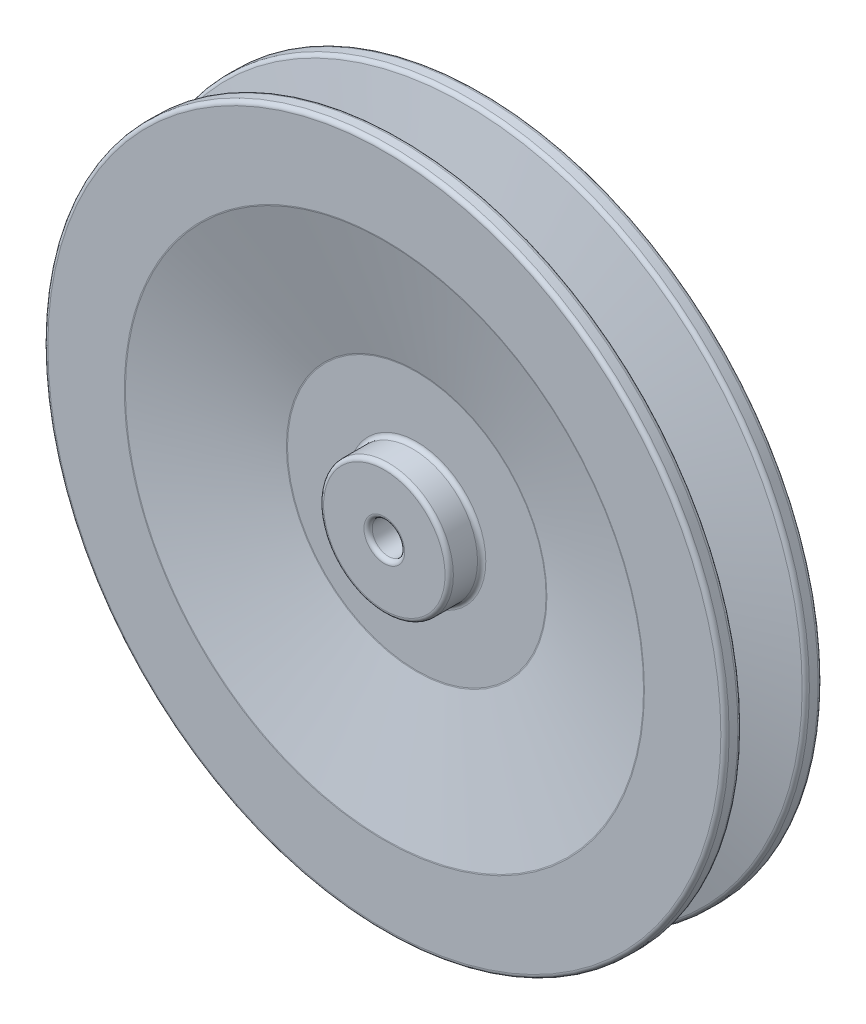
ISO-10303-21;
HEADER;
FILE_DESCRIPTION(('STEP AP214'),'2;1');
FILE_NAME('part.step','',(''),(''),'','','');
FILE_SCHEMA(('AUTOMOTIVE_DESIGN { 1 0 10303 214 1 1 1 1 }'));
ENDSEC;
DATA;
#1=APPLICATION_CONTEXT('core data for automotive mechanical design processes');
#2=APPLICATION_PROTOCOL_DEFINITION('international standard','automotive_design',2000,#1);
#3=PRODUCT_CONTEXT('',#1,'mechanical');
#4=PRODUCT('Part','Part','',(#3));
#5=PRODUCT_RELATED_PRODUCT_CATEGORY('part','',(#4));
#6=PRODUCT_DEFINITION_FORMATION('','',#4);
#7=PRODUCT_DEFINITION_CONTEXT('part definition',#1,'design');
#8=PRODUCT_DEFINITION('design','',#6,#7);
#9=PRODUCT_DEFINITION_SHAPE('','',#8);
#10=(LENGTH_UNIT() NAMED_UNIT(*) SI_UNIT(.MILLI.,.METRE.));
#11=(NAMED_UNIT(*) PLANE_ANGLE_UNIT() SI_UNIT($,.RADIAN.));
#12=(NAMED_UNIT(*) SI_UNIT($,.STERADIAN.) SOLID_ANGLE_UNIT());
#13=UNCERTAINTY_MEASURE_WITH_UNIT(LENGTH_MEASURE(1.E-05),#10,'distance_accuracy_value','');
#14=(GEOMETRIC_REPRESENTATION_CONTEXT(3) GLOBAL_UNCERTAINTY_ASSIGNED_CONTEXT((#13)) GLOBAL_UNIT_ASSIGNED_CONTEXT((#10,
#11,#12)) REPRESENTATION_CONTEXT('',''));
#15=CARTESIAN_POINT('',(0.,0.,0.));
#16=DIRECTION('',(0.,0.,1.));
#17=DIRECTION('',(1.,0.,0.));
#18=AXIS2_PLACEMENT_3D('',#15,#16,#17);
#19=CARTESIAN_POINT('',(0.,0.,-12.7));
#20=DIRECTION('',(0.,0.,-1.));
#21=DIRECTION('',(-1.,0.,0.));
#22=AXIS2_PLACEMENT_3D('',#19,#20,#21);
#23=CONICAL_SURFACE('',#22,25.4,1.32581766366803);
#24=CARTESIAN_POINT('',(0.,0.,-12.7242681758819));
#25=DIRECTION('',(0.,0.,-1.));
#26=DIRECTION('',(-1.,0.,0.));
#27=AXIS2_PLACEMENT_3D('',#24,#25,#26);
#28=CIRCLE('',#27,25.4970727035275);
#29=CARTESIAN_POINT('',(-25.4970727035275,0.,-12.7242681758819));
#30=VERTEX_POINT('',#29);
#31=EDGE_CURVE('E165',#30,#30,#28,.F.);
#32=ORIENTED_EDGE('',*,*,#31,.T.);
#33=EDGE_LOOP('',(#32));
#34=FACE_BOUND('',#33,.T.);
#35=CARTESIAN_POINT('',(0.,0.,-19.0257318241181));
#36=DIRECTION('',(0.,0.,1.));
#37=DIRECTION('',(1.,0.,0.));
#38=AXIS2_PLACEMENT_3D('',#35,#36,#37);
#39=CIRCLE('',#38,50.7029272964725);
#40=CARTESIAN_POINT('',(50.7029272964725,0.,-19.0257318241181));
#41=VERTEX_POINT('',#40);
#42=EDGE_CURVE('E169',#41,#41,#39,.F.);
#43=ORIENTED_EDGE('',*,*,#42,.T.);
#44=EDGE_LOOP('',(#43));
#45=FACE_BOUND('',#44,.T.);
#46=ADVANCED_FACE('F37',(#34,#45),#23,.F.);
#47=CARTESIAN_POINT('',(0.,0.,-12.7));
#48=DIRECTION('',(0.,0.,1.));
#49=DIRECTION('',(1.,0.,0.));
#50=AXIS2_PLACEMENT_3D('',#47,#48,#49);
#51=PLANE('',#50);
#52=CARTESIAN_POINT('',(0.,0.,-12.7));
#53=DIRECTION('',(0.,0.,1.));
#54=DIRECTION('',(1.,0.,0.));
#55=AXIS2_PLACEMENT_3D('',#52,#53,#54);
#56=CIRCLE('',#55,25.299939747498);
#57=CARTESIAN_POINT('',(25.299939747498,0.,-12.7));
#58=VERTEX_POINT('',#57);
#59=EDGE_CURVE('E157',#58,#58,#56,.F.);
#60=ORIENTED_EDGE('',*,*,#59,.T.);
#61=EDGE_LOOP('',(#60));
#62=FACE_BOUND('',#61,.T.);
#63=CARTESIAN_POINT('',(0.,0.,-12.7));
#64=DIRECTION('',(0.,0.,1.));
#65=DIRECTION('',(1.,0.,0.));
#66=AXIS2_PLACEMENT_3D('',#63,#64,#65);
#67=CIRCLE('',#66,13.5128);
#68=CARTESIAN_POINT('',(13.5128,0.,-12.7));
#69=VERTEX_POINT('',#68);
#70=EDGE_CURVE('E161',#69,#69,#67,.T.);
#71=ORIENTED_EDGE('',*,*,#70,.T.);
#72=EDGE_LOOP('',(#71));
#73=FACE_BOUND('',#72,.T.);
#74=ADVANCED_FACE('F184',(#62,#73),#51,.F.);
#75=CARTESIAN_POINT('',(0.,0.,0.));
#76=DIRECTION('',(0.,0.,1.));
#77=DIRECTION('',(1.,0.,0.));
#78=AXIS2_PLACEMENT_3D('',#75,#76,#77);
#79=CYLINDRICAL_SURFACE('',#78,12.7);
#80=CARTESIAN_POINT('',(0.,0.,-13.5128));
#81=DIRECTION('',(0.,0.,1.));
#82=DIRECTION('',(1.,0.,0.));
#83=AXIS2_PLACEMENT_3D('',#80,#81,#82);
#84=CIRCLE('',#83,12.7);
#85=CARTESIAN_POINT('',(12.7,0.,-13.5128));
#86=VERTEX_POINT('',#85);
#87=EDGE_CURVE('E149',#86,#86,#84,.F.);
#88=ORIENTED_EDGE('',*,*,#87,.T.);
#89=EDGE_LOOP('',(#88));
#90=FACE_BOUND('',#89,.T.);
#91=CARTESIAN_POINT('',(0.,0.,-18.2372));
#92=DIRECTION('',(0.,0.,1.));
#93=DIRECTION('',(1.,0.,0.));
#94=AXIS2_PLACEMENT_3D('',#91,#92,#93);
#95=CIRCLE('',#94,12.7);
#96=CARTESIAN_POINT('',(12.7,0.,-18.2372));
#97=VERTEX_POINT('',#96);
#98=EDGE_CURVE('E153',#97,#97,#95,.T.);
#99=ORIENTED_EDGE('',*,*,#98,.T.);
#100=EDGE_LOOP('',(#99));
#101=FACE_BOUND('',#100,.T.);
#102=ADVANCED_FACE('F190',(#90,#101),#79,.T.);
#103=CARTESIAN_POINT('',(0.,0.,-19.05));
#104=DIRECTION('',(0.,0.,1.));
#105=DIRECTION('',(1.,0.,0.));
#106=AXIS2_PLACEMENT_3D('',#103,#104,#105);
#107=PLANE('',#106);
#108=CARTESIAN_POINT('',(0.,0.,-19.05));
#109=DIRECTION('',(0.,0.,1.));
#110=DIRECTION('',(1.,0.,0.));
#111=AXIS2_PLACEMENT_3D('',#108,#109,#110);
#112=CIRCLE('',#111,11.8872);
#113=CARTESIAN_POINT('',(11.8872,0.,-19.05));
#114=VERTEX_POINT('',#113);
#115=EDGE_CURVE('E141',#114,#114,#112,.F.);
#116=ORIENTED_EDGE('',*,*,#115,.T.);
#117=EDGE_LOOP('',(#116));
#118=FACE_BOUND('',#117,.T.);
#119=CARTESIAN_POINT('',(0.,0.,-19.05));
#120=DIRECTION('',(0.,0.,1.));
#121=DIRECTION('',(1.,0.,0.));
#122=AXIS2_PLACEMENT_3D('',#119,#120,#121);
#123=CIRCLE('',#122,3.9878);
#124=CARTESIAN_POINT('',(3.9878,0.,-19.05));
#125=VERTEX_POINT('',#124);
#126=EDGE_CURVE('E145',#125,#125,#123,.T.);
#127=ORIENTED_EDGE('',*,*,#126,.T.);
#128=EDGE_LOOP('',(#127));
#129=FACE_BOUND('',#128,.T.);
#130=ADVANCED_FACE('F303',(#118,#129),#107,.F.);
#131=CARTESIAN_POINT('',(0.,0.,0.));
#132=DIRECTION('',(0.,0.,1.));
#133=DIRECTION('',(1.,0.,0.));
#134=AXIS2_PLACEMENT_3D('',#131,#132,#133);
#135=CYLINDRICAL_SURFACE('',#134,3.175);
#136=CARTESIAN_POINT('',(0.,0.,-18.2372));
#137=DIRECTION('',(0.,0.,1.));
#138=DIRECTION('',(1.,0.,0.));
#139=AXIS2_PLACEMENT_3D('',#136,#137,#138);
#140=CIRCLE('',#139,3.175);
#141=CARTESIAN_POINT('',(3.175,0.,-18.2372));
#142=VERTEX_POINT('',#141);
#143=EDGE_CURVE('E133',#142,#142,#140,.F.);
#144=ORIENTED_EDGE('',*,*,#143,.T.);
#145=EDGE_LOOP('',(#144));
#146=FACE_BOUND('',#145,.T.);
#147=CARTESIAN_POINT('',(0.,0.,-0.8128));
#148=DIRECTION('',(0.,0.,1.));
#149=DIRECTION('',(1.,0.,0.));
#150=AXIS2_PLACEMENT_3D('',#147,#148,#149);
#151=CIRCLE('',#150,3.175);
#152=CARTESIAN_POINT('',(3.175,0.,-0.8128));
#153=VERTEX_POINT('',#152);
#154=EDGE_CURVE('E137',#153,#153,#151,.T.);
#155=ORIENTED_EDGE('',*,*,#154,.T.);
#156=EDGE_LOOP('',(#155));
#157=FACE_BOUND('',#156,.T.);
#158=ADVANCED_FACE('F299',(#146,#157),#135,.F.);
#159=CARTESIAN_POINT('',(0.,0.,0.));
#160=DIRECTION('',(0.,0.,1.));
#161=DIRECTION('',(1.,0.,0.));
#162=AXIS2_PLACEMENT_3D('',#159,#160,#161);
#163=PLANE('',#162);
#164=CARTESIAN_POINT('',(0.,0.,0.));
#165=DIRECTION('',(0.,0.,1.));
#166=DIRECTION('',(1.,0.,0.));
#167=AXIS2_PLACEMENT_3D('',#164,#165,#166);
#168=CIRCLE('',#167,3.9878);
#169=CARTESIAN_POINT('',(3.9878,0.,0.));
#170=VERTEX_POINT('',#169);
#171=EDGE_CURVE('E125',#170,#170,#168,.F.);
#172=ORIENTED_EDGE('',*,*,#171,.T.);
#173=EDGE_LOOP('',(#172));
#174=FACE_BOUND('',#173,.T.);
#175=CARTESIAN_POINT('',(0.,0.,0.));
#176=DIRECTION('',(0.,0.,1.));
#177=DIRECTION('',(1.,0.,0.));
#178=AXIS2_PLACEMENT_3D('',#175,#176,#177);
#179=CIRCLE('',#178,11.8872);
#180=CARTESIAN_POINT('',(11.8872,0.,0.));
#181=VERTEX_POINT('',#180);
#182=EDGE_CURVE('E129',#181,#181,#179,.T.);
#183=ORIENTED_EDGE('',*,*,#182,.T.);
#184=EDGE_LOOP('',(#183));
#185=FACE_BOUND('',#184,.T.);
#186=ADVANCED_FACE('F295',(#174,#185),#163,.T.);
#187=CARTESIAN_POINT('',(0.,0.,0.));
#188=DIRECTION('',(0.,0.,1.));
#189=DIRECTION('',(1.,0.,0.));
#190=AXIS2_PLACEMENT_3D('',#187,#188,#189);
#191=CYLINDRICAL_SURFACE('',#190,12.7);
#192=CARTESIAN_POINT('',(0.,0.,-0.8128));
#193=DIRECTION('',(0.,0.,1.));
#194=DIRECTION('',(1.,0.,0.));
#195=AXIS2_PLACEMENT_3D('',#192,#193,#194);
#196=CIRCLE('',#195,12.7);
#197=CARTESIAN_POINT('',(12.7,0.,-0.8128));
#198=VERTEX_POINT('',#197);
#199=EDGE_CURVE('E117',#198,#198,#196,.F.);
#200=ORIENTED_EDGE('',*,*,#199,.T.);
#201=EDGE_LOOP('',(#200));
#202=FACE_BOUND('',#201,.T.);
#203=CARTESIAN_POINT('',(0.,0.,-5.5372));
#204=DIRECTION('',(0.,0.,1.));
#205=DIRECTION('',(1.,0.,0.));
#206=AXIS2_PLACEMENT_3D('',#203,#204,#205);
#207=CIRCLE('',#206,12.7);
#208=CARTESIAN_POINT('',(12.7,0.,-5.5372));
#209=VERTEX_POINT('',#208);
#210=EDGE_CURVE('E121',#209,#209,#207,.T.);
#211=ORIENTED_EDGE('',*,*,#210,.T.);
#212=EDGE_LOOP('',(#211));
#213=FACE_BOUND('',#212,.T.);
#214=ADVANCED_FACE('F291',(#202,#213),#191,.T.);
#215=CARTESIAN_POINT('',(0.,0.,-6.35));
#216=DIRECTION('',(0.,0.,1.));
#217=DIRECTION('',(1.,0.,0.));
#218=AXIS2_PLACEMENT_3D('',#215,#216,#217);
#219=PLANE('',#218);
#220=CARTESIAN_POINT('',(0.,0.,-6.35));
#221=DIRECTION('',(0.,0.,1.));
#222=DIRECTION('',(1.,0.,0.));
#223=AXIS2_PLACEMENT_3D('',#220,#221,#222);
#224=CIRCLE('',#223,13.5128);
#225=CARTESIAN_POINT('',(13.5128,0.,-6.35));
#226=VERTEX_POINT('',#225);
#227=EDGE_CURVE('E109',#226,#226,#224,.F.);
#228=ORIENTED_EDGE('',*,*,#227,.T.);
#229=EDGE_LOOP('',(#228));
#230=FACE_BOUND('',#229,.T.);
#231=CARTESIAN_POINT('',(0.,0.,-6.35));
#232=DIRECTION('',(0.,0.,1.));
#233=DIRECTION('',(1.,0.,0.));
#234=AXIS2_PLACEMENT_3D('',#231,#232,#233);
#235=CIRCLE('',#234,25.299939747498);
#236=CARTESIAN_POINT('',(25.299939747498,0.,-6.35));
#237=VERTEX_POINT('',#236);
#238=EDGE_CURVE('E113',#237,#237,#235,.T.);
#239=ORIENTED_EDGE('',*,*,#238,.T.);
#240=EDGE_LOOP('',(#239));
#241=FACE_BOUND('',#240,.T.);
#242=ADVANCED_FACE('F287',(#230,#241),#219,.T.);
#243=CARTESIAN_POINT('',(0.,0.,-6.35));
#244=DIRECTION('',(0.,0.,1.));
#245=DIRECTION('',(1.,0.,0.));
#246=AXIS2_PLACEMENT_3D('',#243,#244,#245);
#247=CONICAL_SURFACE('',#246,25.4,1.32581766366803);
#248=CARTESIAN_POINT('',(0.,0.,-6.32573182411812));
#249=DIRECTION('',(0.,0.,1.));
#250=DIRECTION('',(1.,0.,0.));
#251=AXIS2_PLACEMENT_3D('',#248,#249,#250);
#252=CIRCLE('',#251,25.4970727035275);
#253=CARTESIAN_POINT('',(25.4970727035275,0.,-6.32573182411812));
#254=VERTEX_POINT('',#253);
#255=EDGE_CURVE('E101',#254,#254,#252,.F.);
#256=ORIENTED_EDGE('',*,*,#255,.T.);
#257=EDGE_LOOP('',(#256));
#258=FACE_BOUND('',#257,.T.);
#259=CARTESIAN_POINT('',(0.,0.,-0.0242681758818777));
#260=DIRECTION('',(0.,0.,-1.));
#261=DIRECTION('',(-1.,0.,0.));
#262=AXIS2_PLACEMENT_3D('',#259,#260,#261);
#263=CIRCLE('',#262,50.7029272964725);
#264=CARTESIAN_POINT('',(-50.7029272964725,0.,-0.0242681758818777));
#265=VERTEX_POINT('',#264);
#266=EDGE_CURVE('E105',#265,#265,#263,.F.);
#267=ORIENTED_EDGE('',*,*,#266,.T.);
#268=EDGE_LOOP('',(#267));
#269=FACE_BOUND('',#268,.T.);
#270=ADVANCED_FACE('F283',(#258,#269),#247,.F.);
#271=CARTESIAN_POINT('',(0.,0.,0.));
#272=DIRECTION('',(0.,0.,1.));
#273=DIRECTION('',(1.,0.,0.));
#274=AXIS2_PLACEMENT_3D('',#271,#272,#273);
#275=PLANE('',#274);
#276=CARTESIAN_POINT('',(0.,0.,0.));
#277=DIRECTION('',(0.,0.,1.));
#278=DIRECTION('',(1.,0.,0.));
#279=AXIS2_PLACEMENT_3D('',#276,#277,#278);
#280=CIRCLE('',#279,50.900060252502);
#281=CARTESIAN_POINT('',(50.900060252502,0.,0.));
#282=VERTEX_POINT('',#281);
#283=EDGE_CURVE('E93',#282,#282,#280,.F.);
#284=ORIENTED_EDGE('',*,*,#283,.T.);
#285=EDGE_LOOP('',(#284));
#286=FACE_BOUND('',#285,.T.);
#287=CARTESIAN_POINT('',(0.,0.,0.));
#288=DIRECTION('',(0.,0.,1.));
#289=DIRECTION('',(1.,0.,0.));
#290=AXIS2_PLACEMENT_3D('',#287,#288,#289);
#291=CIRCLE('',#290,65.8622);
#292=CARTESIAN_POINT('',(65.8622,0.,0.));
#293=VERTEX_POINT('',#292);
#294=EDGE_CURVE('E97',#293,#293,#291,.T.);
#295=ORIENTED_EDGE('',*,*,#294,.T.);
#296=EDGE_LOOP('',(#295));
#297=FACE_BOUND('',#296,.T.);
#298=ADVANCED_FACE('F279',(#286,#297),#275,.T.);
#299=CARTESIAN_POINT('',(0.,0.,0.));
#300=DIRECTION('',(0.,0.,1.));
#301=DIRECTION('',(1.,0.,0.));
#302=AXIS2_PLACEMENT_3D('',#299,#300,#301);
#303=CYLINDRICAL_SURFACE('',#302,66.675);
#304=CARTESIAN_POINT('',(0.,0.,-0.812800000000001));
#305=DIRECTION('',(0.,0.,1.));
#306=DIRECTION('',(1.,0.,0.));
#307=AXIS2_PLACEMENT_3D('',#304,#305,#306);
#308=CIRCLE('',#307,66.675);
#309=CARTESIAN_POINT('',(66.675,0.,-0.812800000000001));
#310=VERTEX_POINT('',#309);
#311=EDGE_CURVE('E85',#310,#310,#308,.F.);
#312=ORIENTED_EDGE('',*,*,#311,.T.);
#313=EDGE_LOOP('',(#312));
#314=FACE_BOUND('',#313,.T.);
#315=CARTESIAN_POINT('',(0.,0.,-2.53095251073807));
#316=DIRECTION('',(0.,0.,-1.));
#317=DIRECTION('',(-1.,0.,0.));
#318=AXIS2_PLACEMENT_3D('',#315,#316,#317);
#319=CIRCLE('',#318,66.675);
#320=CARTESIAN_POINT('',(-66.675,0.,-2.53095251073807));
#321=VERTEX_POINT('',#320);
#322=EDGE_CURVE('E89',#321,#321,#319,.F.);
#323=ORIENTED_EDGE('',*,*,#322,.T.);
#324=EDGE_LOOP('',(#323));
#325=FACE_BOUND('',#324,.T.);
#326=ADVANCED_FACE('F275',(#314,#325),#303,.T.);
#327=CARTESIAN_POINT('',(0.,0.,-6.90274747535291));
#328=DIRECTION('',(0.,0.,1.));
#329=DIRECTION('',(1.,0.,0.));
#330=AXIS2_PLACEMENT_3D('',#327,#328,#329);
#331=CONICAL_SURFACE('',#330,50.8,1.34015614843929);
#332=CARTESIAN_POINT('',(0.,0.,-3.32222976930502));
#333=DIRECTION('',(0.,0.,1.));
#334=DIRECTION('',(1.,0.,0.));
#335=AXIS2_PLACEMENT_3D('',#332,#333,#334);
#336=CIRCLE('',#335,66.0480067277434);
#337=CARTESIAN_POINT('',(66.0480067277434,0.,-3.32222976930502));
#338=VERTEX_POINT('',#337);
#339=EDGE_CURVE('E77',#338,#338,#336,.F.);
#340=ORIENTED_EDGE('',*,*,#339,.T.);
#341=EDGE_LOOP('',(#340));
#342=FACE_BOUND('',#341,.T.);
#343=CARTESIAN_POINT('',(0.,0.,-6.75551770604785));
#344=DIRECTION('',(0.,0.,1.));
#345=DIRECTION('',(1.,0.,0.));
#346=AXIS2_PLACEMENT_3D('',#343,#344,#345);
#347=CIRCLE('',#346,51.4269932722566);
#348=CARTESIAN_POINT('',(51.4269932722566,0.,-6.75551770604785));
#349=VERTEX_POINT('',#348);
#350=EDGE_CURVE('E81',#349,#349,#347,.T.);
#351=ORIENTED_EDGE('',*,*,#350,.T.);
#352=EDGE_LOOP('',(#351));
#353=FACE_BOUND('',#352,.T.);
#354=ADVANCED_FACE('F268',(#342,#353),#331,.T.);
#355=CARTESIAN_POINT('',(0.,0.,0.));
#356=DIRECTION('',(0.,0.,1.));
#357=DIRECTION('',(1.,0.,0.));
#358=AXIS2_PLACEMENT_3D('',#355,#356,#357);
#359=CYLINDRICAL_SURFACE('',#358,50.8);
#360=CARTESIAN_POINT('',(0.,0.,-7.54679496461484));
#361=DIRECTION('',(0.,0.,1.));
#362=DIRECTION('',(1.,0.,0.));
#363=AXIS2_PLACEMENT_3D('',#360,#361,#362);
#364=CIRCLE('',#363,50.8);
#365=CARTESIAN_POINT('',(50.8,0.,-7.54679496461484));
#366=VERTEX_POINT('',#365);
#367=EDGE_CURVE('E69',#366,#366,#364,.F.);
#368=ORIENTED_EDGE('',*,*,#367,.T.);
#369=EDGE_LOOP('',(#368));
#370=FACE_BOUND('',#369,.T.);
#371=CARTESIAN_POINT('',(0.,0.,-11.5032050353852));
#372=DIRECTION('',(0.,0.,1.));
#373=DIRECTION('',(1.,0.,0.));
#374=AXIS2_PLACEMENT_3D('',#371,#372,#373);
#375=CIRCLE('',#374,50.8);
#376=CARTESIAN_POINT('',(50.8,0.,-11.5032050353852));
#377=VERTEX_POINT('',#376);
#378=EDGE_CURVE('E73',#377,#377,#375,.T.);
#379=ORIENTED_EDGE('',*,*,#378,.T.);
#380=EDGE_LOOP('',(#379));
#381=FACE_BOUND('',#380,.T.);
#382=ADVANCED_FACE('F259',(#370,#381),#359,.T.);
#383=CARTESIAN_POINT('',(0.,0.,-12.1472525246471));
#384=DIRECTION('',(0.,0.,-1.));
#385=DIRECTION('',(-1.,0.,0.));
#386=AXIS2_PLACEMENT_3D('',#383,#384,#385);
#387=CONICAL_SURFACE('',#386,50.8,1.34015614843929);
#388=CARTESIAN_POINT('',(0.,0.,-12.2944822939521));
#389=DIRECTION('',(0.,0.,1.));
#390=DIRECTION('',(1.,0.,0.));
#391=AXIS2_PLACEMENT_3D('',#388,#389,#390);
#392=CIRCLE('',#391,51.4269932722565);
#393=CARTESIAN_POINT('',(51.4269932722565,0.,-12.2944822939521));
#394=VERTEX_POINT('',#393);
#395=EDGE_CURVE('E61',#394,#394,#392,.F.);
#396=ORIENTED_EDGE('',*,*,#395,.T.);
#397=EDGE_LOOP('',(#396));
#398=FACE_BOUND('',#397,.T.);
#399=CARTESIAN_POINT('',(0.,0.,-15.7277702306949));
#400=DIRECTION('',(0.,0.,-1.));
#401=DIRECTION('',(-1.,0.,0.));
#402=AXIS2_PLACEMENT_3D('',#399,#400,#401);
#403=CIRCLE('',#402,66.0480067277434);
#404=CARTESIAN_POINT('',(-66.0480067277434,0.,-15.7277702306949));
#405=VERTEX_POINT('',#404);
#406=EDGE_CURVE('E65',#405,#405,#403,.F.);
#407=ORIENTED_EDGE('',*,*,#406,.T.);
#408=EDGE_LOOP('',(#407));
#409=FACE_BOUND('',#408,.T.);
#410=ADVANCED_FACE('F256',(#398,#409),#387,.T.);
#411=CARTESIAN_POINT('',(0.,0.,0.));
#412=DIRECTION('',(0.,0.,1.));
#413=DIRECTION('',(1.,0.,0.));
#414=AXIS2_PLACEMENT_3D('',#411,#412,#413);
#415=CYLINDRICAL_SURFACE('',#414,66.675);
#416=CARTESIAN_POINT('',(0.,0.,-16.5190474892619));
#417=DIRECTION('',(0.,0.,-1.));
#418=DIRECTION('',(-1.,0.,0.));
#419=AXIS2_PLACEMENT_3D('',#416,#417,#418);
#420=CIRCLE('',#419,66.675);
#421=CARTESIAN_POINT('',(-66.675,0.,-16.5190474892619));
#422=VERTEX_POINT('',#421);
#423=EDGE_CURVE('E50',#422,#422,#420,.T.);
#424=ORIENTED_EDGE('',*,*,#423,.T.);
#425=EDGE_LOOP('',(#424));
#426=FACE_BOUND('',#425,.T.);
#427=CARTESIAN_POINT('',(0.,0.,-18.2372));
#428=DIRECTION('',(0.,0.,1.));
#429=DIRECTION('',(1.,0.,0.));
#430=AXIS2_PLACEMENT_3D('',#427,#428,#429);
#431=CIRCLE('',#430,66.675);
#432=CARTESIAN_POINT('',(66.675,0.,-18.2372));
#433=VERTEX_POINT('',#432);
#434=EDGE_CURVE('E55',#433,#433,#431,.T.);
#435=ORIENTED_EDGE('',*,*,#434,.T.);
#436=EDGE_LOOP('',(#435));
#437=FACE_BOUND('',#436,.T.);
#438=ADVANCED_FACE('F258',(#426,#437),#415,.T.);
#439=CARTESIAN_POINT('',(0.,0.,-19.05));
#440=DIRECTION('',(0.,0.,1.));
#441=DIRECTION('',(1.,0.,0.));
#442=AXIS2_PLACEMENT_3D('',#439,#440,#441);
#443=PLANE('',#442);
#444=CARTESIAN_POINT('',(0.,0.,-19.05));
#445=DIRECTION('',(0.,0.,1.));
#446=DIRECTION('',(1.,0.,0.));
#447=AXIS2_PLACEMENT_3D('',#444,#445,#446);
#448=CIRCLE('',#447,65.8622);
#449=CARTESIAN_POINT('',(65.8622,0.,-19.05));
#450=VERTEX_POINT('',#449);
#451=EDGE_CURVE('E10',#450,#450,#448,.F.);
#452=ORIENTED_EDGE('',*,*,#451,.T.);
#453=EDGE_LOOP('',(#452));
#454=FACE_BOUND('',#453,.T.);
#455=CARTESIAN_POINT('',(0.,0.,-19.05));
#456=DIRECTION('',(0.,0.,1.));
#457=DIRECTION('',(1.,0.,0.));
#458=AXIS2_PLACEMENT_3D('',#455,#456,#457);
#459=CIRCLE('',#458,50.900060252502);
#460=CARTESIAN_POINT('',(50.900060252502,0.,-19.05));
#461=VERTEX_POINT('',#460);
#462=EDGE_CURVE('E45',#461,#461,#459,.T.);
#463=ORIENTED_EDGE('',*,*,#462,.T.);
#464=EDGE_LOOP('',(#463));
#465=FACE_BOUND('',#464,.T.);
#466=ADVANCED_FACE('F199',(#454,#465),#443,.F.);
#467=CARTESIAN_POINT('',(0.,0.,-13.5128));
#468=DIRECTION('',(0.,0.,1.));
#469=DIRECTION('',(1.,0.,0.));
#470=AXIS2_PLACEMENT_3D('',#467,#468,#469);
#471=TOROIDAL_SURFACE('',#470,25.299939747498,0.8128);
#472=ORIENTED_EDGE('',*,*,#59,.F.);
#473=EDGE_LOOP('',(#472));
#474=FACE_BOUND('',#473,.T.);
#475=ORIENTED_EDGE('',*,*,#31,.F.);
#476=EDGE_LOOP('',(#475));
#477=FACE_BOUND('',#476,.T.);
#478=ADVANCED_FACE('F195',(#474,#477),#471,.F.);
#479=CARTESIAN_POINT('',(0.,0.,-13.5128));
#480=DIRECTION('',(0.,0.,1.));
#481=DIRECTION('',(1.,0.,0.));
#482=AXIS2_PLACEMENT_3D('',#479,#480,#481);
#483=TOROIDAL_SURFACE('',#482,13.5128,0.8128);
#484=ORIENTED_EDGE('',*,*,#87,.F.);
#485=EDGE_LOOP('',(#484));
#486=FACE_BOUND('',#485,.T.);
#487=ORIENTED_EDGE('',*,*,#70,.F.);
#488=EDGE_LOOP('',(#487));
#489=FACE_BOUND('',#488,.T.);
#490=ADVANCED_FACE('F198',(#486,#489),#483,.F.);
#491=CARTESIAN_POINT('',(0.,0.,-18.2372));
#492=DIRECTION('',(0.,0.,1.));
#493=DIRECTION('',(1.,0.,0.));
#494=AXIS2_PLACEMENT_3D('',#491,#492,#493);
#495=TOROIDAL_SURFACE('',#494,11.8872,0.8128);
#496=ORIENTED_EDGE('',*,*,#115,.F.);
#497=EDGE_LOOP('',(#496));
#498=FACE_BOUND('',#497,.T.);
#499=ORIENTED_EDGE('',*,*,#98,.F.);
#500=EDGE_LOOP('',(#499));
#501=FACE_BOUND('',#500,.T.);
#502=ADVANCED_FACE('F203',(#498,#501),#495,.T.);
#503=CARTESIAN_POINT('',(0.,0.,-18.2372));
#504=DIRECTION('',(0.,0.,1.));
#505=DIRECTION('',(1.,0.,0.));
#506=AXIS2_PLACEMENT_3D('',#503,#504,#505);
#507=TOROIDAL_SURFACE('',#506,3.9878,0.8128);
#508=ORIENTED_EDGE('',*,*,#143,.F.);
#509=EDGE_LOOP('',(#508));
#510=FACE_BOUND('',#509,.T.);
#511=ORIENTED_EDGE('',*,*,#126,.F.);
#512=EDGE_LOOP('',(#511));
#513=FACE_BOUND('',#512,.T.);
#514=ADVANCED_FACE('F207',(#510,#513),#507,.T.);
#515=CARTESIAN_POINT('',(0.,0.,-0.8128));
#516=DIRECTION('',(0.,0.,1.));
#517=DIRECTION('',(1.,0.,0.));
#518=AXIS2_PLACEMENT_3D('',#515,#516,#517);
#519=TOROIDAL_SURFACE('',#518,3.9878,0.8128);
#520=ORIENTED_EDGE('',*,*,#171,.F.);
#521=EDGE_LOOP('',(#520));
#522=FACE_BOUND('',#521,.T.);
#523=ORIENTED_EDGE('',*,*,#154,.F.);
#524=EDGE_LOOP('',(#523));
#525=FACE_BOUND('',#524,.T.);
#526=ADVANCED_FACE('F211',(#522,#525),#519,.T.);
#527=CARTESIAN_POINT('',(0.,0.,-0.8128));
#528=DIRECTION('',(0.,0.,1.));
#529=DIRECTION('',(1.,0.,0.));
#530=AXIS2_PLACEMENT_3D('',#527,#528,#529);
#531=TOROIDAL_SURFACE('',#530,11.8872,0.8128);
#532=ORIENTED_EDGE('',*,*,#199,.F.);
#533=EDGE_LOOP('',(#532));
#534=FACE_BOUND('',#533,.T.);
#535=ORIENTED_EDGE('',*,*,#182,.F.);
#536=EDGE_LOOP('',(#535));
#537=FACE_BOUND('',#536,.T.);
#538=ADVANCED_FACE('F215',(#534,#537),#531,.T.);
#539=CARTESIAN_POINT('',(0.,0.,-5.5372));
#540=DIRECTION('',(0.,0.,1.));
#541=DIRECTION('',(1.,0.,0.));
#542=AXIS2_PLACEMENT_3D('',#539,#540,#541);
#543=TOROIDAL_SURFACE('',#542,13.5128,0.8128);
#544=ORIENTED_EDGE('',*,*,#227,.F.);
#545=EDGE_LOOP('',(#544));
#546=FACE_BOUND('',#545,.T.);
#547=ORIENTED_EDGE('',*,*,#210,.F.);
#548=EDGE_LOOP('',(#547));
#549=FACE_BOUND('',#548,.T.);
#550=ADVANCED_FACE('F219',(#546,#549),#543,.F.);
#551=CARTESIAN_POINT('',(0.,0.,-5.5372));
#552=DIRECTION('',(0.,0.,1.));
#553=DIRECTION('',(1.,0.,0.));
#554=AXIS2_PLACEMENT_3D('',#551,#552,#553);
#555=TOROIDAL_SURFACE('',#554,25.299939747498,0.8128);
#556=ORIENTED_EDGE('',*,*,#255,.F.);
#557=EDGE_LOOP('',(#556));
#558=FACE_BOUND('',#557,.T.);
#559=ORIENTED_EDGE('',*,*,#238,.F.);
#560=EDGE_LOOP('',(#559));
#561=FACE_BOUND('',#560,.T.);
#562=ADVANCED_FACE('F223',(#558,#561),#555,.F.);
#563=CARTESIAN_POINT('',(0.,0.,-0.812800000000001));
#564=DIRECTION('',(0.,0.,1.));
#565=DIRECTION('',(1.,0.,0.));
#566=AXIS2_PLACEMENT_3D('',#563,#564,#565);
#567=TOROIDAL_SURFACE('',#566,50.900060252502,0.8128);
#568=ORIENTED_EDGE('',*,*,#283,.F.);
#569=EDGE_LOOP('',(#568));
#570=FACE_BOUND('',#569,.T.);
#571=ORIENTED_EDGE('',*,*,#266,.F.);
#572=EDGE_LOOP('',(#571));
#573=FACE_BOUND('',#572,.T.);
#574=ADVANCED_FACE('F227',(#570,#573),#567,.T.);
#575=CARTESIAN_POINT('',(0.,0.,-0.812800000000001));
#576=DIRECTION('',(0.,0.,1.));
#577=DIRECTION('',(1.,0.,0.));
#578=AXIS2_PLACEMENT_3D('',#575,#576,#577);
#579=TOROIDAL_SURFACE('',#578,65.8622,0.8128);
#580=ORIENTED_EDGE('',*,*,#311,.F.);
#581=EDGE_LOOP('',(#580));
#582=FACE_BOUND('',#581,.T.);
#583=ORIENTED_EDGE('',*,*,#294,.F.);
#584=EDGE_LOOP('',(#583));
#585=FACE_BOUND('',#584,.T.);
#586=ADVANCED_FACE('F231',(#582,#585),#579,.T.);
#587=CARTESIAN_POINT('',(0.,0.,-2.53095251073807));
#588=DIRECTION('',(0.,0.,-1.));
#589=DIRECTION('',(-1.,0.,0.));
#590=AXIS2_PLACEMENT_3D('',#587,#588,#589);
#591=TOROIDAL_SURFACE('',#590,65.8622,0.8128);
#592=ORIENTED_EDGE('',*,*,#339,.F.);
#593=EDGE_LOOP('',(#592));
#594=FACE_BOUND('',#593,.T.);
#595=ORIENTED_EDGE('',*,*,#322,.F.);
#596=EDGE_LOOP('',(#595));
#597=FACE_BOUND('',#596,.T.);
#598=ADVANCED_FACE('F235',(#594,#597),#591,.T.);
#599=CARTESIAN_POINT('',(0.,0.,-7.54679496461484));
#600=DIRECTION('',(0.,0.,1.));
#601=DIRECTION('',(1.,0.,0.));
#602=AXIS2_PLACEMENT_3D('',#599,#600,#601);
#603=TOROIDAL_SURFACE('',#602,51.6128,0.8128);
#604=ORIENTED_EDGE('',*,*,#367,.F.);
#605=EDGE_LOOP('',(#604));
#606=FACE_BOUND('',#605,.T.);
#607=ORIENTED_EDGE('',*,*,#350,.F.);
#608=EDGE_LOOP('',(#607));
#609=FACE_BOUND('',#608,.T.);
#610=ADVANCED_FACE('F239',(#606,#609),#603,.F.);
#611=CARTESIAN_POINT('',(0.,0.,-11.5032050353852));
#612=DIRECTION('',(0.,0.,1.));
#613=DIRECTION('',(1.,0.,0.));
#614=AXIS2_PLACEMENT_3D('',#611,#612,#613);
#615=TOROIDAL_SURFACE('',#614,51.6128,0.8128);
#616=ORIENTED_EDGE('',*,*,#395,.F.);
#617=EDGE_LOOP('',(#616));
#618=FACE_BOUND('',#617,.T.);
#619=ORIENTED_EDGE('',*,*,#378,.F.);
#620=EDGE_LOOP('',(#619));
#621=FACE_BOUND('',#620,.T.);
#622=ADVANCED_FACE('F243',(#618,#621),#615,.F.);
#623=CARTESIAN_POINT('',(0.,0.,-16.5190474892619));
#624=DIRECTION('',(0.,0.,-1.));
#625=DIRECTION('',(-1.,0.,0.));
#626=AXIS2_PLACEMENT_3D('',#623,#624,#625);
#627=TOROIDAL_SURFACE('',#626,65.8622,0.8128);
#628=ORIENTED_EDGE('',*,*,#423,.F.);
#629=EDGE_LOOP('',(#628));
#630=FACE_BOUND('',#629,.T.);
#631=ORIENTED_EDGE('',*,*,#406,.F.);
#632=EDGE_LOOP('',(#631));
#633=FACE_BOUND('',#632,.T.);
#634=ADVANCED_FACE('F181',(#630,#633),#627,.T.);
#635=CARTESIAN_POINT('',(0.,0.,-18.2372));
#636=DIRECTION('',(0.,0.,1.));
#637=DIRECTION('',(1.,0.,0.));
#638=AXIS2_PLACEMENT_3D('',#635,#636,#637);
#639=TOROIDAL_SURFACE('',#638,65.8622,0.8128);
#640=ORIENTED_EDGE('',*,*,#451,.F.);
#641=EDGE_LOOP('',(#640));
#642=FACE_BOUND('',#641,.T.);
#643=ORIENTED_EDGE('',*,*,#434,.F.);
#644=EDGE_LOOP('',(#643));
#645=FACE_BOUND('',#644,.T.);
#646=ADVANCED_FACE('F177',(#642,#645),#639,.T.);
#647=CARTESIAN_POINT('',(0.,0.,-18.2372));
#648=DIRECTION('',(0.,0.,1.));
#649=DIRECTION('',(1.,0.,0.));
#650=AXIS2_PLACEMENT_3D('',#647,#648,#649);
#651=TOROIDAL_SURFACE('',#650,50.900060252502,0.8128);
#652=ORIENTED_EDGE('',*,*,#42,.F.);
#653=EDGE_LOOP('',(#652));
#654=FACE_BOUND('',#653,.T.);
#655=ORIENTED_EDGE('',*,*,#462,.F.);
#656=EDGE_LOOP('',(#655));
#657=FACE_BOUND('',#656,.T.);
#658=ADVANCED_FACE('F39',(#654,#657),#651,.T.);
#659=CLOSED_SHELL('',(#46,#74,#102,#130,#158,#186,#214,#242,#270,#298,#326,#354,#382,#410,#438,
#466,#478,#490,#502,#514,#526,#538,#550,#562,#574,#586,#598,#610,#622,#634,#646,#658));
#660=MANIFOLD_SOLID_BREP('B2',#659);
#661=ADVANCED_BREP_SHAPE_REPRESENTATION('',(#18,#660),#14);
#662=SHAPE_DEFINITION_REPRESENTATION(#9,#661);
ENDSEC;
END-ISO-10303-21;
